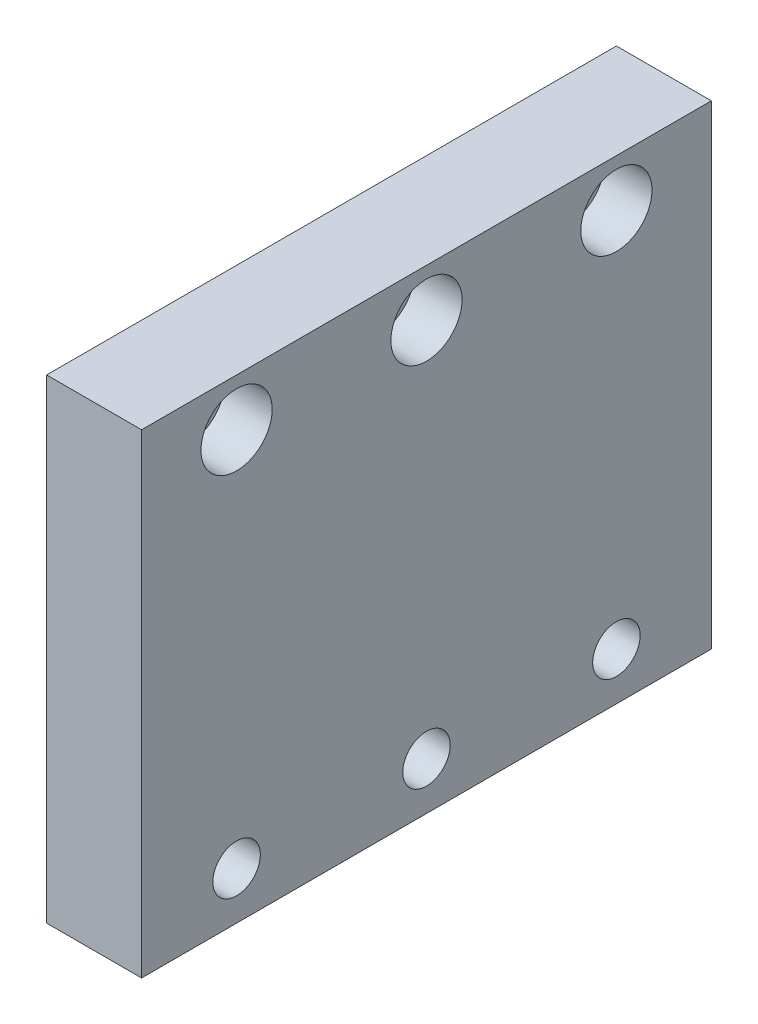
ISO-10303-21;
HEADER;
FILE_DESCRIPTION(('STEP AP214'),'2;1');
FILE_NAME('part.step','',(''),(''),'','','');
FILE_SCHEMA(('AUTOMOTIVE_DESIGN { 1 0 10303 214 1 1 1 1 }'));
ENDSEC;
DATA;
#1=APPLICATION_CONTEXT('core data for automotive mechanical design processes');
#2=APPLICATION_PROTOCOL_DEFINITION('international standard','automotive_design',2000,#1);
#3=PRODUCT_CONTEXT('',#1,'mechanical');
#4=PRODUCT('Part','Part','',(#3));
#5=PRODUCT_RELATED_PRODUCT_CATEGORY('part','',(#4));
#6=PRODUCT_DEFINITION_FORMATION('','',#4);
#7=PRODUCT_DEFINITION_CONTEXT('part definition',#1,'design');
#8=PRODUCT_DEFINITION('design','',#6,#7);
#9=PRODUCT_DEFINITION_SHAPE('','',#8);
#10=(LENGTH_UNIT() NAMED_UNIT(*) SI_UNIT(.MILLI.,.METRE.));
#11=(NAMED_UNIT(*) PLANE_ANGLE_UNIT() SI_UNIT($,.RADIAN.));
#12=(NAMED_UNIT(*) SI_UNIT($,.STERADIAN.) SOLID_ANGLE_UNIT());
#13=UNCERTAINTY_MEASURE_WITH_UNIT(LENGTH_MEASURE(1.E-05),#10,'distance_accuracy_value','');
#14=(GEOMETRIC_REPRESENTATION_CONTEXT(3) GLOBAL_UNCERTAINTY_ASSIGNED_CONTEXT((#13)) GLOBAL_UNIT_ASSIGNED_CONTEXT((#10,
#11,#12)) REPRESENTATION_CONTEXT('',''));
#15=CARTESIAN_POINT('',(0.,0.,0.));
#16=DIRECTION('',(0.,0.,1.));
#17=DIRECTION('',(1.,0.,0.));
#18=AXIS2_PLACEMENT_3D('',#15,#16,#17);
#19=CARTESIAN_POINT('',(-6.35,31.75,38.1));
#20=DIRECTION('',(0.,-1.,0.));
#21=DIRECTION('',(0.,0.,-1.));
#22=AXIS2_PLACEMENT_3D('',#19,#20,#21);
#23=PLANE('',#22);
#24=DIRECTION('',(-1.,0.,0.));
#25=VECTOR('',#24,1.);
#26=CARTESIAN_POINT('',(-6.35,31.75,-38.1));
#27=LINE('',#26,#25);
#28=CARTESIAN_POINT('',(6.35000000000004,31.75,-38.1));
#29=VERTEX_POINT('',#28);
#30=CARTESIAN_POINT('',(-6.35,31.75,-38.1));
#31=VERTEX_POINT('',#30);
#32=EDGE_CURVE('E102',#29,#31,#27,.T.);
#33=ORIENTED_EDGE('',*,*,#32,.T.);
#34=DIRECTION('',(0.,0.,-1.));
#35=VECTOR('',#34,1.);
#36=CARTESIAN_POINT('',(-6.35,31.75,38.1));
#37=LINE('',#36,#35);
#38=CARTESIAN_POINT('',(-6.35,31.75,38.1));
#39=VERTEX_POINT('',#38);
#40=EDGE_CURVE('E56',#39,#31,#37,.T.);
#41=ORIENTED_EDGE('',*,*,#40,.F.);
#42=DIRECTION('',(-1.,0.,0.));
#43=VECTOR('',#42,1.);
#44=CARTESIAN_POINT('',(-6.35,31.75,38.1));
#45=LINE('',#44,#43);
#46=CARTESIAN_POINT('',(6.35000000000004,31.75,38.1));
#47=VERTEX_POINT('',#46);
#48=EDGE_CURVE('E94',#47,#39,#45,.T.);
#49=ORIENTED_EDGE('',*,*,#48,.F.);
#50=DIRECTION('',(0.,0.,-1.));
#51=VECTOR('',#50,1.);
#52=CARTESIAN_POINT('',(6.35000000000004,31.75,38.1));
#53=LINE('',#52,#51);
#54=EDGE_CURVE('E13',#47,#29,#53,.T.);
#55=ORIENTED_EDGE('',*,*,#54,.T.);
#56=EDGE_LOOP('',(#33,#41,#49,#55));
#57=FACE_BOUND('',#56,.T.);
#58=ADVANCED_FACE('F48',(#57),#23,.F.);
#59=CARTESIAN_POINT('',(-6.35,19.05,38.1));
#60=DIRECTION('',(1.,0.,0.));
#61=DIRECTION('',(0.,1.,0.));
#62=AXIS2_PLACEMENT_3D('',#59,#60,#61);
#63=PLANE('',#62);
#64=CARTESIAN_POINT('',(-6.35000000000002,25.4,25.4));
#65=DIRECTION('',(1.,0.,0.));
#66=DIRECTION('',(0.,0.,-1.));
#67=AXIS2_PLACEMENT_3D('',#64,#65,#66);
#68=CIRCLE('',#67,3.175);
#69=CARTESIAN_POINT('',(-6.35000000000002,25.4,22.225));
#70=VERTEX_POINT('',#69);
#71=EDGE_CURVE('E146',#70,#70,#68,.T.);
#72=ORIENTED_EDGE('',*,*,#71,.T.);
#73=EDGE_LOOP('',(#72));
#74=FACE_BOUND('',#73,.T.);
#75=CARTESIAN_POINT('',(-6.35000000000002,25.4,0.));
#76=DIRECTION('',(1.,0.,0.));
#77=DIRECTION('',(0.,0.,-1.));
#78=AXIS2_PLACEMENT_3D('',#75,#76,#77);
#79=CIRCLE('',#78,3.175);
#80=CARTESIAN_POINT('',(-6.35000000000002,25.4,-3.175));
#81=VERTEX_POINT('',#80);
#82=EDGE_CURVE('E150',#81,#81,#79,.T.);
#83=ORIENTED_EDGE('',*,*,#82,.T.);
#84=EDGE_LOOP('',(#83));
#85=FACE_BOUND('',#84,.T.);
#86=CARTESIAN_POINT('',(-6.35000000000002,25.4,-25.4));
#87=DIRECTION('',(1.,0.,0.));
#88=DIRECTION('',(0.,0.,-1.));
#89=AXIS2_PLACEMENT_3D('',#86,#87,#88);
#90=CIRCLE('',#89,3.175);
#91=CARTESIAN_POINT('',(-6.35000000000002,25.4,-28.575));
#92=VERTEX_POINT('',#91);
#93=EDGE_CURVE('E154',#92,#92,#90,.T.);
#94=ORIENTED_EDGE('',*,*,#93,.T.);
#95=EDGE_LOOP('',(#94));
#96=FACE_BOUND('',#95,.T.);
#97=CARTESIAN_POINT('',(-6.35,-25.4,-25.4));
#98=DIRECTION('',(-1.,0.,0.));
#99=DIRECTION('',(0.,0.,1.));
#100=AXIS2_PLACEMENT_3D('',#97,#98,#99);
#101=CIRCLE('',#100,4.76249999999999);
#102=CARTESIAN_POINT('',(-6.35,-25.4,-20.6375));
#103=VERTEX_POINT('',#102);
#104=EDGE_CURVE('E158',#103,#103,#101,.T.);
#105=ORIENTED_EDGE('',*,*,#104,.F.);
#106=EDGE_LOOP('',(#105));
#107=FACE_BOUND('',#106,.T.);
#108=CARTESIAN_POINT('',(-6.35,-25.4,0.));
#109=DIRECTION('',(-1.,0.,0.));
#110=DIRECTION('',(0.,0.,1.));
#111=AXIS2_PLACEMENT_3D('',#108,#109,#110);
#112=CIRCLE('',#111,4.76249999999999);
#113=CARTESIAN_POINT('',(-6.35,-25.4,4.76249999999999));
#114=VERTEX_POINT('',#113);
#115=EDGE_CURVE('E162',#114,#114,#112,.T.);
#116=ORIENTED_EDGE('',*,*,#115,.F.);
#117=EDGE_LOOP('',(#116));
#118=FACE_BOUND('',#117,.T.);
#119=CARTESIAN_POINT('',(-6.35,-25.4,25.4));
#120=DIRECTION('',(-1.,0.,0.));
#121=DIRECTION('',(0.,0.,1.));
#122=AXIS2_PLACEMENT_3D('',#119,#120,#121);
#123=CIRCLE('',#122,4.76249999999999);
#124=CARTESIAN_POINT('',(-6.35,-25.4,30.1625));
#125=VERTEX_POINT('',#124);
#126=EDGE_CURVE('E165',#125,#125,#123,.T.);
#127=ORIENTED_EDGE('',*,*,#126,.F.);
#128=EDGE_LOOP('',(#127));
#129=FACE_BOUND('',#128,.T.);
#130=DIRECTION('',(0.,-1.,0.));
#131=VECTOR('',#130,1.);
#132=CARTESIAN_POINT('',(-6.35,19.05,-38.1));
#133=LINE('',#132,#131);
#134=CARTESIAN_POINT('',(-6.35,-31.75,-38.1));
#135=VERTEX_POINT('',#134);
#136=EDGE_CURVE('E81',#31,#135,#133,.T.);
#137=ORIENTED_EDGE('',*,*,#136,.T.);
#138=DIRECTION('',(0.,0.,-1.));
#139=VECTOR('',#138,1.);
#140=CARTESIAN_POINT('',(-6.35,-31.75,38.1));
#141=LINE('',#140,#139);
#142=CARTESIAN_POINT('',(-6.35,-31.75,38.1));
#143=VERTEX_POINT('',#142);
#144=EDGE_CURVE('E103',#143,#135,#141,.T.);
#145=ORIENTED_EDGE('',*,*,#144,.F.);
#146=DIRECTION('',(0.,-1.,0.));
#147=VECTOR('',#146,1.);
#148=CARTESIAN_POINT('',(-6.35,31.75,38.1));
#149=LINE('',#148,#147);
#150=EDGE_CURVE('E98',#39,#143,#149,.T.);
#151=ORIENTED_EDGE('',*,*,#150,.F.);
#152=ORIENTED_EDGE('',*,*,#40,.T.);
#153=EDGE_LOOP('',(#137,#145,#151,#152));
#154=FACE_BOUND('',#153,.T.);
#155=ADVANCED_FACE('F104',(#74,#85,#96,#107,#118,#129,#154),#63,.F.);
#156=CARTESIAN_POINT('',(-6.35,-31.75,38.1));
#157=DIRECTION('',(0.,1.,0.));
#158=DIRECTION('',(-1.,0.,0.));
#159=AXIS2_PLACEMENT_3D('',#156,#157,#158);
#160=PLANE('',#159);
#161=DIRECTION('',(1.,0.,0.));
#162=VECTOR('',#161,1.);
#163=CARTESIAN_POINT('',(-6.35,-31.75,-38.1));
#164=LINE('',#163,#162);
#165=CARTESIAN_POINT('',(6.35000000000005,-31.75,-38.1));
#166=VERTEX_POINT('',#165);
#167=EDGE_CURVE('E88',#135,#166,#164,.T.);
#168=ORIENTED_EDGE('',*,*,#167,.T.);
#169=DIRECTION('',(0.,0.,-1.));
#170=VECTOR('',#169,1.);
#171=CARTESIAN_POINT('',(6.35000000000005,-31.75,38.1));
#172=LINE('',#171,#170);
#173=CARTESIAN_POINT('',(6.35000000000005,-31.75,38.1));
#174=VERTEX_POINT('',#173);
#175=EDGE_CURVE('E108',#174,#166,#172,.T.);
#176=ORIENTED_EDGE('',*,*,#175,.F.);
#177=DIRECTION('',(1.,0.,0.));
#178=VECTOR('',#177,1.);
#179=CARTESIAN_POINT('',(-6.35,-31.75,38.1));
#180=LINE('',#179,#178);
#181=EDGE_CURVE('E106',#143,#174,#180,.T.);
#182=ORIENTED_EDGE('',*,*,#181,.F.);
#183=ORIENTED_EDGE('',*,*,#144,.T.);
#184=EDGE_LOOP('',(#168,#176,#182,#183));
#185=FACE_BOUND('',#184,.T.);
#186=ADVANCED_FACE('F119',(#185),#160,.F.);
#187=CARTESIAN_POINT('',(6.35000000000005,-19.0499999999999,38.1));
#188=DIRECTION('',(-1.,0.,0.));
#189=DIRECTION('',(0.,-1.,0.));
#190=AXIS2_PLACEMENT_3D('',#187,#188,#189);
#191=PLANE('',#190);
#192=CARTESIAN_POINT('',(6.35000000000004,25.4,25.4));
#193=DIRECTION('',(1.,0.,0.));
#194=DIRECTION('',(0.,0.,-1.));
#195=AXIS2_PLACEMENT_3D('',#192,#193,#194);
#196=CIRCLE('',#195,4.76249999999999);
#197=CARTESIAN_POINT('',(6.35000000000004,25.4,20.6375));
#198=VERTEX_POINT('',#197);
#199=EDGE_CURVE('E389',#198,#198,#196,.T.);
#200=ORIENTED_EDGE('',*,*,#199,.F.);
#201=EDGE_LOOP('',(#200));
#202=FACE_BOUND('',#201,.T.);
#203=CARTESIAN_POINT('',(6.35000000000004,25.4,0.));
#204=DIRECTION('',(1.,0.,0.));
#205=DIRECTION('',(0.,0.,-1.));
#206=AXIS2_PLACEMENT_3D('',#203,#204,#205);
#207=CIRCLE('',#206,4.76249999999999);
#208=CARTESIAN_POINT('',(6.35000000000004,25.4,-4.76249999999999));
#209=VERTEX_POINT('',#208);
#210=EDGE_CURVE('E397',#209,#209,#207,.T.);
#211=ORIENTED_EDGE('',*,*,#210,.F.);
#212=EDGE_LOOP('',(#211));
#213=FACE_BOUND('',#212,.T.);
#214=CARTESIAN_POINT('',(6.35000000000004,25.4,-25.4));
#215=DIRECTION('',(1.,0.,0.));
#216=DIRECTION('',(0.,0.,-1.));
#217=AXIS2_PLACEMENT_3D('',#214,#215,#216);
#218=CIRCLE('',#217,4.76249999999999);
#219=CARTESIAN_POINT('',(6.35000000000004,25.4,-30.1625));
#220=VERTEX_POINT('',#219);
#221=EDGE_CURVE('E407',#220,#220,#218,.T.);
#222=ORIENTED_EDGE('',*,*,#221,.F.);
#223=EDGE_LOOP('',(#222));
#224=FACE_BOUND('',#223,.T.);
#225=CARTESIAN_POINT('',(6.35000000000004,-25.4,-25.4));
#226=DIRECTION('',(-1.,0.,0.));
#227=DIRECTION('',(0.,0.,1.));
#228=AXIS2_PLACEMENT_3D('',#225,#226,#227);
#229=CIRCLE('',#228,3.175);
#230=CARTESIAN_POINT('',(6.35000000000004,-25.4,-22.225));
#231=VERTEX_POINT('',#230);
#232=EDGE_CURVE('E424',#231,#231,#229,.T.);
#233=ORIENTED_EDGE('',*,*,#232,.T.);
#234=EDGE_LOOP('',(#233));
#235=FACE_BOUND('',#234,.T.);
#236=CARTESIAN_POINT('',(6.35000000000004,-25.4,0.));
#237=DIRECTION('',(-1.,0.,0.));
#238=DIRECTION('',(0.,0.,1.));
#239=AXIS2_PLACEMENT_3D('',#236,#237,#238);
#240=CIRCLE('',#239,3.175);
#241=CARTESIAN_POINT('',(6.35000000000004,-25.4,3.175));
#242=VERTEX_POINT('',#241);
#243=EDGE_CURVE('E168',#242,#242,#240,.T.);
#244=ORIENTED_EDGE('',*,*,#243,.T.);
#245=EDGE_LOOP('',(#244));
#246=FACE_BOUND('',#245,.T.);
#247=CARTESIAN_POINT('',(6.35000000000004,-25.4,25.4));
#248=DIRECTION('',(-1.,0.,0.));
#249=DIRECTION('',(0.,0.,1.));
#250=AXIS2_PLACEMENT_3D('',#247,#248,#249);
#251=CIRCLE('',#250,3.175);
#252=CARTESIAN_POINT('',(6.35000000000004,-25.4,28.575));
#253=VERTEX_POINT('',#252);
#254=EDGE_CURVE('E113',#253,#253,#251,.T.);
#255=ORIENTED_EDGE('',*,*,#254,.T.);
#256=EDGE_LOOP('',(#255));
#257=FACE_BOUND('',#256,.T.);
#258=DIRECTION('',(0.,1.,0.));
#259=VECTOR('',#258,1.);
#260=CARTESIAN_POINT('',(6.35000000000005,-19.0499999999999,-38.1));
#261=LINE('',#260,#259);
#262=EDGE_CURVE('E116',#166,#29,#261,.T.);
#263=ORIENTED_EDGE('',*,*,#262,.T.);
#264=ORIENTED_EDGE('',*,*,#54,.F.);
#265=DIRECTION('',(0.,1.,0.));
#266=VECTOR('',#265,1.);
#267=CARTESIAN_POINT('',(6.35000000000004,31.75,38.1));
#268=LINE('',#267,#266);
#269=EDGE_CURVE('E64',#174,#47,#268,.T.);
#270=ORIENTED_EDGE('',*,*,#269,.F.);
#271=ORIENTED_EDGE('',*,*,#175,.T.);
#272=EDGE_LOOP('',(#263,#264,#270,#271));
#273=FACE_BOUND('',#272,.T.);
#274=ADVANCED_FACE('F123',(#202,#213,#224,#235,#246,#257,#273),#191,.F.);
#275=CARTESIAN_POINT('',(0.,0.,38.1));
#276=DIRECTION('',(0.,0.,1.));
#277=DIRECTION('',(1.,0.,0.));
#278=AXIS2_PLACEMENT_3D('',#275,#276,#277);
#279=PLANE('',#278);
#280=ORIENTED_EDGE('',*,*,#269,.T.);
#281=ORIENTED_EDGE('',*,*,#48,.T.);
#282=ORIENTED_EDGE('',*,*,#150,.T.);
#283=ORIENTED_EDGE('',*,*,#181,.T.);
#284=EDGE_LOOP('',(#280,#281,#282,#283));
#285=FACE_BOUND('',#284,.T.);
#286=ADVANCED_FACE('F96',(#285),#279,.T.);
#287=CARTESIAN_POINT('',(0.,0.,-38.1));
#288=DIRECTION('',(0.,0.,1.));
#289=DIRECTION('',(1.,0.,0.));
#290=AXIS2_PLACEMENT_3D('',#287,#288,#289);
#291=PLANE('',#290);
#292=ORIENTED_EDGE('',*,*,#32,.F.);
#293=ORIENTED_EDGE('',*,*,#262,.F.);
#294=ORIENTED_EDGE('',*,*,#167,.F.);
#295=ORIENTED_EDGE('',*,*,#136,.F.);
#296=EDGE_LOOP('',(#292,#293,#294,#295));
#297=FACE_BOUND('',#296,.T.);
#298=ADVANCED_FACE('F122',(#297),#291,.F.);
#299=CARTESIAN_POINT('',(-6.35,-25.4,25.4));
#300=DIRECTION('',(-1.,0.,0.));
#301=DIRECTION('',(0.,0.,1.));
#302=AXIS2_PLACEMENT_3D('',#299,#300,#301);
#303=CYLINDRICAL_SURFACE('',#302,3.17500000000001);
#304=ORIENTED_EDGE('',*,*,#254,.F.);
#305=EDGE_LOOP('',(#304));
#306=FACE_BOUND('',#305,.T.);
#307=CARTESIAN_POINT('',(0.,-25.4,25.4));
#308=DIRECTION('',(-1.,0.,0.));
#309=DIRECTION('',(0.,0.,1.));
#310=AXIS2_PLACEMENT_3D('',#307,#308,#309);
#311=CIRCLE('',#310,3.17500000000001);
#312=CARTESIAN_POINT('',(0.,-25.4,28.575));
#313=VERTEX_POINT('',#312);
#314=EDGE_CURVE('E171',#313,#313,#311,.T.);
#315=ORIENTED_EDGE('',*,*,#314,.T.);
#316=EDGE_LOOP('',(#315));
#317=FACE_BOUND('',#316,.T.);
#318=ADVANCED_FACE('F184',(#306,#317),#303,.F.);
#319=CARTESIAN_POINT('',(0.,-22.225,25.4));
#320=DIRECTION('',(1.,0.,0.));
#321=DIRECTION('',(0.,0.,-1.));
#322=AXIS2_PLACEMENT_3D('',#319,#320,#321);
#323=PLANE('',#322);
#324=ORIENTED_EDGE('',*,*,#314,.F.);
#325=EDGE_LOOP('',(#324));
#326=FACE_BOUND('',#325,.T.);
#327=CARTESIAN_POINT('',(0.,-25.4,25.4));
#328=DIRECTION('',(-1.,0.,0.));
#329=DIRECTION('',(0.,0.,1.));
#330=AXIS2_PLACEMENT_3D('',#327,#328,#329);
#331=CIRCLE('',#330,4.76249999999999);
#332=CARTESIAN_POINT('',(0.,-25.4,30.1625));
#333=VERTEX_POINT('',#332);
#334=EDGE_CURVE('E167',#333,#333,#331,.T.);
#335=ORIENTED_EDGE('',*,*,#334,.T.);
#336=EDGE_LOOP('',(#335));
#337=FACE_BOUND('',#336,.T.);
#338=ADVANCED_FACE('F187',(#326,#337),#323,.F.);
#339=CARTESIAN_POINT('',(-6.35,-25.4,25.4));
#340=DIRECTION('',(-1.,0.,0.));
#341=DIRECTION('',(0.,0.,1.));
#342=AXIS2_PLACEMENT_3D('',#339,#340,#341);
#343=CYLINDRICAL_SURFACE('',#342,4.76249999999999);
#344=ORIENTED_EDGE('',*,*,#334,.F.);
#345=EDGE_LOOP('',(#344));
#346=FACE_BOUND('',#345,.T.);
#347=ORIENTED_EDGE('',*,*,#126,.T.);
#348=EDGE_LOOP('',(#347));
#349=FACE_BOUND('',#348,.T.);
#350=ADVANCED_FACE('F193',(#346,#349),#343,.F.);
#351=CARTESIAN_POINT('',(-6.35,-25.4,0.));
#352=DIRECTION('',(-1.,0.,0.));
#353=DIRECTION('',(0.,0.,1.));
#354=AXIS2_PLACEMENT_3D('',#351,#352,#353);
#355=CYLINDRICAL_SURFACE('',#354,3.17500000000001);
#356=ORIENTED_EDGE('',*,*,#243,.F.);
#357=EDGE_LOOP('',(#356));
#358=FACE_BOUND('',#357,.T.);
#359=CARTESIAN_POINT('',(0.,-25.4,0.));
#360=DIRECTION('',(-1.,0.,0.));
#361=DIRECTION('',(0.,0.,1.));
#362=AXIS2_PLACEMENT_3D('',#359,#360,#361);
#363=CIRCLE('',#362,3.17500000000001);
#364=CARTESIAN_POINT('',(0.,-25.4,3.17500000000001));
#365=VERTEX_POINT('',#364);
#366=EDGE_CURVE('E174',#365,#365,#363,.T.);
#367=ORIENTED_EDGE('',*,*,#366,.T.);
#368=EDGE_LOOP('',(#367));
#369=FACE_BOUND('',#368,.T.);
#370=ADVANCED_FACE('F198',(#358,#369),#355,.F.);
#371=CARTESIAN_POINT('',(0.,-22.225,0.));
#372=DIRECTION('',(1.,0.,0.));
#373=DIRECTION('',(0.,0.,-1.));
#374=AXIS2_PLACEMENT_3D('',#371,#372,#373);
#375=PLANE('',#374);
#376=ORIENTED_EDGE('',*,*,#366,.F.);
#377=EDGE_LOOP('',(#376));
#378=FACE_BOUND('',#377,.T.);
#379=CARTESIAN_POINT('',(0.,-25.4,0.));
#380=DIRECTION('',(-1.,0.,0.));
#381=DIRECTION('',(0.,0.,1.));
#382=AXIS2_PLACEMENT_3D('',#379,#380,#381);
#383=CIRCLE('',#382,4.76249999999999);
#384=CARTESIAN_POINT('',(0.,-25.4,4.76249999999999));
#385=VERTEX_POINT('',#384);
#386=EDGE_CURVE('E428',#385,#385,#383,.T.);
#387=ORIENTED_EDGE('',*,*,#386,.T.);
#388=EDGE_LOOP('',(#387));
#389=FACE_BOUND('',#388,.T.);
#390=ADVANCED_FACE('F203',(#378,#389),#375,.F.);
#391=CARTESIAN_POINT('',(-6.35,-25.4,0.));
#392=DIRECTION('',(-1.,0.,0.));
#393=DIRECTION('',(0.,0.,1.));
#394=AXIS2_PLACEMENT_3D('',#391,#392,#393);
#395=CYLINDRICAL_SURFACE('',#394,4.76249999999999);
#396=ORIENTED_EDGE('',*,*,#386,.F.);
#397=EDGE_LOOP('',(#396));
#398=FACE_BOUND('',#397,.T.);
#399=ORIENTED_EDGE('',*,*,#115,.T.);
#400=EDGE_LOOP('',(#399));
#401=FACE_BOUND('',#400,.T.);
#402=ADVANCED_FACE('F239',(#398,#401),#395,.F.);
#403=CARTESIAN_POINT('',(-6.35,-25.4,-25.4));
#404=DIRECTION('',(-1.,0.,0.));
#405=DIRECTION('',(0.,0.,1.));
#406=AXIS2_PLACEMENT_3D('',#403,#404,#405);
#407=CYLINDRICAL_SURFACE('',#406,3.17500000000001);
#408=ORIENTED_EDGE('',*,*,#232,.F.);
#409=EDGE_LOOP('',(#408));
#410=FACE_BOUND('',#409,.T.);
#411=CARTESIAN_POINT('',(0.,-25.4,-25.4));
#412=DIRECTION('',(-1.,0.,0.));
#413=DIRECTION('',(0.,0.,1.));
#414=AXIS2_PLACEMENT_3D('',#411,#412,#413);
#415=CIRCLE('',#414,3.17500000000001);
#416=CARTESIAN_POINT('',(0.,-25.4,-22.225));
#417=VERTEX_POINT('',#416);
#418=EDGE_CURVE('E421',#417,#417,#415,.T.);
#419=ORIENTED_EDGE('',*,*,#418,.T.);
#420=EDGE_LOOP('',(#419));
#421=FACE_BOUND('',#420,.T.);
#422=ADVANCED_FACE('F248',(#410,#421),#407,.F.);
#423=CARTESIAN_POINT('',(0.,-22.225,-25.4));
#424=DIRECTION('',(1.,0.,0.));
#425=DIRECTION('',(0.,0.,-1.));
#426=AXIS2_PLACEMENT_3D('',#423,#424,#425);
#427=PLANE('',#426);
#428=ORIENTED_EDGE('',*,*,#418,.F.);
#429=EDGE_LOOP('',(#428));
#430=FACE_BOUND('',#429,.T.);
#431=CARTESIAN_POINT('',(0.,-25.4,-25.4));
#432=DIRECTION('',(-1.,0.,0.));
#433=DIRECTION('',(0.,0.,1.));
#434=AXIS2_PLACEMENT_3D('',#431,#432,#433);
#435=CIRCLE('',#434,4.76249999999999);
#436=CARTESIAN_POINT('',(0.,-25.4,-20.6375));
#437=VERTEX_POINT('',#436);
#438=EDGE_CURVE('E418',#437,#437,#435,.T.);
#439=ORIENTED_EDGE('',*,*,#438,.T.);
#440=EDGE_LOOP('',(#439));
#441=FACE_BOUND('',#440,.T.);
#442=ADVANCED_FACE('F258',(#430,#441),#427,.F.);
#443=CARTESIAN_POINT('',(-6.35,-25.4,-25.4));
#444=DIRECTION('',(-1.,0.,0.));
#445=DIRECTION('',(0.,0.,1.));
#446=AXIS2_PLACEMENT_3D('',#443,#444,#445);
#447=CYLINDRICAL_SURFACE('',#446,4.76249999999999);
#448=ORIENTED_EDGE('',*,*,#438,.F.);
#449=EDGE_LOOP('',(#448));
#450=FACE_BOUND('',#449,.T.);
#451=ORIENTED_EDGE('',*,*,#104,.T.);
#452=EDGE_LOOP('',(#451));
#453=FACE_BOUND('',#452,.T.);
#454=ADVANCED_FACE('F268',(#450,#453),#447,.F.);
#455=CARTESIAN_POINT('',(6.35000000000004,25.4,-25.4));
#456=DIRECTION('',(1.,0.,0.));
#457=DIRECTION('',(0.,0.,-1.));
#458=AXIS2_PLACEMENT_3D('',#455,#456,#457);
#459=CYLINDRICAL_SURFACE('',#458,3.175);
#460=ORIENTED_EDGE('',*,*,#93,.F.);
#461=EDGE_LOOP('',(#460));
#462=FACE_BOUND('',#461,.T.);
#463=CARTESIAN_POINT('',(0.,25.4,-25.4));
#464=DIRECTION('',(1.,0.,0.));
#465=DIRECTION('',(0.,0.,-1.));
#466=AXIS2_PLACEMENT_3D('',#463,#464,#465);
#467=CIRCLE('',#466,3.175);
#468=CARTESIAN_POINT('',(0.,25.4,-28.575));
#469=VERTEX_POINT('',#468);
#470=EDGE_CURVE('E413',#469,#469,#467,.T.);
#471=ORIENTED_EDGE('',*,*,#470,.T.);
#472=EDGE_LOOP('',(#471));
#473=FACE_BOUND('',#472,.T.);
#474=ADVANCED_FACE('F277',(#462,#473),#459,.F.);
#475=CARTESIAN_POINT('',(0.,28.575,-25.4));
#476=DIRECTION('',(-1.,0.,0.));
#477=DIRECTION('',(0.,0.,1.));
#478=AXIS2_PLACEMENT_3D('',#475,#476,#477);
#479=PLANE('',#478);
#480=ORIENTED_EDGE('',*,*,#470,.F.);
#481=EDGE_LOOP('',(#480));
#482=FACE_BOUND('',#481,.T.);
#483=CARTESIAN_POINT('',(0.,25.4,-25.4));
#484=DIRECTION('',(1.,0.,0.));
#485=DIRECTION('',(0.,0.,-1.));
#486=AXIS2_PLACEMENT_3D('',#483,#484,#485);
#487=CIRCLE('',#486,4.7625);
#488=CARTESIAN_POINT('',(0.,25.4,-30.1625));
#489=VERTEX_POINT('',#488);
#490=EDGE_CURVE('E410',#489,#489,#487,.T.);
#491=ORIENTED_EDGE('',*,*,#490,.T.);
#492=EDGE_LOOP('',(#491));
#493=FACE_BOUND('',#492,.T.);
#494=ADVANCED_FACE('F300',(#482,#493),#479,.F.);
#495=CARTESIAN_POINT('',(6.35000000000004,25.4,-25.4));
#496=DIRECTION('',(1.,0.,0.));
#497=DIRECTION('',(0.,0.,-1.));
#498=AXIS2_PLACEMENT_3D('',#495,#496,#497);
#499=CYLINDRICAL_SURFACE('',#498,4.76249999999999);
#500=ORIENTED_EDGE('',*,*,#490,.F.);
#501=EDGE_LOOP('',(#500));
#502=FACE_BOUND('',#501,.T.);
#503=ORIENTED_EDGE('',*,*,#221,.T.);
#504=EDGE_LOOP('',(#503));
#505=FACE_BOUND('',#504,.T.);
#506=ADVANCED_FACE('F310',(#502,#505),#499,.F.);
#507=CARTESIAN_POINT('',(6.35000000000004,25.4,0.));
#508=DIRECTION('',(1.,0.,0.));
#509=DIRECTION('',(0.,0.,-1.));
#510=AXIS2_PLACEMENT_3D('',#507,#508,#509);
#511=CYLINDRICAL_SURFACE('',#510,3.175);
#512=ORIENTED_EDGE('',*,*,#82,.F.);
#513=EDGE_LOOP('',(#512));
#514=FACE_BOUND('',#513,.T.);
#515=CARTESIAN_POINT('',(0.,25.4,0.));
#516=DIRECTION('',(1.,0.,0.));
#517=DIRECTION('',(0.,0.,-1.));
#518=AXIS2_PLACEMENT_3D('',#515,#516,#517);
#519=CIRCLE('',#518,3.175);
#520=CARTESIAN_POINT('',(0.,25.4,-3.175));
#521=VERTEX_POINT('',#520);
#522=EDGE_CURVE('E403',#521,#521,#519,.T.);
#523=ORIENTED_EDGE('',*,*,#522,.T.);
#524=EDGE_LOOP('',(#523));
#525=FACE_BOUND('',#524,.T.);
#526=ADVANCED_FACE('F320',(#514,#525),#511,.F.);
#527=CARTESIAN_POINT('',(0.,28.575,0.));
#528=DIRECTION('',(-1.,0.,0.));
#529=DIRECTION('',(0.,0.,1.));
#530=AXIS2_PLACEMENT_3D('',#527,#528,#529);
#531=PLANE('',#530);
#532=ORIENTED_EDGE('',*,*,#522,.F.);
#533=EDGE_LOOP('',(#532));
#534=FACE_BOUND('',#533,.T.);
#535=CARTESIAN_POINT('',(0.,25.4,0.));
#536=DIRECTION('',(1.,0.,0.));
#537=DIRECTION('',(0.,0.,-1.));
#538=AXIS2_PLACEMENT_3D('',#535,#536,#537);
#539=CIRCLE('',#538,4.7625);
#540=CARTESIAN_POINT('',(0.,25.4,-4.7625));
#541=VERTEX_POINT('',#540);
#542=EDGE_CURVE('E400',#541,#541,#539,.T.);
#543=ORIENTED_EDGE('',*,*,#542,.T.);
#544=EDGE_LOOP('',(#543));
#545=FACE_BOUND('',#544,.T.);
#546=ADVANCED_FACE('F330',(#534,#545),#531,.F.);
#547=CARTESIAN_POINT('',(6.35000000000004,25.4,0.));
#548=DIRECTION('',(1.,0.,0.));
#549=DIRECTION('',(0.,0.,-1.));
#550=AXIS2_PLACEMENT_3D('',#547,#548,#549);
#551=CYLINDRICAL_SURFACE('',#550,4.76249999999999);
#552=ORIENTED_EDGE('',*,*,#542,.F.);
#553=EDGE_LOOP('',(#552));
#554=FACE_BOUND('',#553,.T.);
#555=ORIENTED_EDGE('',*,*,#210,.T.);
#556=EDGE_LOOP('',(#555));
#557=FACE_BOUND('',#556,.T.);
#558=ADVANCED_FACE('F340',(#554,#557),#551,.F.);
#559=CARTESIAN_POINT('',(6.35000000000004,25.4,25.4));
#560=DIRECTION('',(1.,0.,0.));
#561=DIRECTION('',(0.,0.,-1.));
#562=AXIS2_PLACEMENT_3D('',#559,#560,#561);
#563=CYLINDRICAL_SURFACE('',#562,3.175);
#564=ORIENTED_EDGE('',*,*,#71,.F.);
#565=EDGE_LOOP('',(#564));
#566=FACE_BOUND('',#565,.T.);
#567=CARTESIAN_POINT('',(0.,25.4,25.4));
#568=DIRECTION('',(1.,0.,0.));
#569=DIRECTION('',(0.,0.,-1.));
#570=AXIS2_PLACEMENT_3D('',#567,#568,#569);
#571=CIRCLE('',#570,3.175);
#572=CARTESIAN_POINT('',(0.,25.4,22.225));
#573=VERTEX_POINT('',#572);
#574=EDGE_CURVE('E391',#573,#573,#571,.T.);
#575=ORIENTED_EDGE('',*,*,#574,.T.);
#576=EDGE_LOOP('',(#575));
#577=FACE_BOUND('',#576,.T.);
#578=ADVANCED_FACE('F350',(#566,#577),#563,.F.);
#579=CARTESIAN_POINT('',(0.,28.575,25.4));
#580=DIRECTION('',(-1.,0.,0.));
#581=DIRECTION('',(0.,0.,1.));
#582=AXIS2_PLACEMENT_3D('',#579,#580,#581);
#583=PLANE('',#582);
#584=ORIENTED_EDGE('',*,*,#574,.F.);
#585=EDGE_LOOP('',(#584));
#586=FACE_BOUND('',#585,.T.);
#587=CARTESIAN_POINT('',(0.,25.4,25.4));
#588=DIRECTION('',(1.,0.,0.));
#589=DIRECTION('',(0.,0.,-1.));
#590=AXIS2_PLACEMENT_3D('',#587,#588,#589);
#591=CIRCLE('',#590,4.7625);
#592=CARTESIAN_POINT('',(0.,25.4,20.6375));
#593=VERTEX_POINT('',#592);
#594=EDGE_CURVE('E387',#593,#593,#591,.T.);
#595=ORIENTED_EDGE('',*,*,#594,.T.);
#596=EDGE_LOOP('',(#595));
#597=FACE_BOUND('',#596,.T.);
#598=ADVANCED_FACE('F360',(#586,#597),#583,.F.);
#599=CARTESIAN_POINT('',(6.35000000000004,25.4,25.4));
#600=DIRECTION('',(1.,0.,0.));
#601=DIRECTION('',(0.,0.,-1.));
#602=AXIS2_PLACEMENT_3D('',#599,#600,#601);
#603=CYLINDRICAL_SURFACE('',#602,4.76249999999999);
#604=ORIENTED_EDGE('',*,*,#594,.F.);
#605=EDGE_LOOP('',(#604));
#606=FACE_BOUND('',#605,.T.);
#607=ORIENTED_EDGE('',*,*,#199,.T.);
#608=EDGE_LOOP('',(#607));
#609=FACE_BOUND('',#608,.T.);
#610=ADVANCED_FACE('F370',(#606,#609),#603,.F.);
#611=CLOSED_SHELL('',(#58,#155,#186,#274,#286,#298,#318,#338,#350,#370,#390,#402,#422,#442,#454,
#474,#494,#506,#526,#546,#558,#578,#598,#610));
#612=MANIFOLD_SOLID_BREP('B2',#611);
#613=ADVANCED_BREP_SHAPE_REPRESENTATION('',(#18,#612),#14);
#614=SHAPE_DEFINITION_REPRESENTATION(#9,#613);
ENDSEC;
END-ISO-10303-21;
